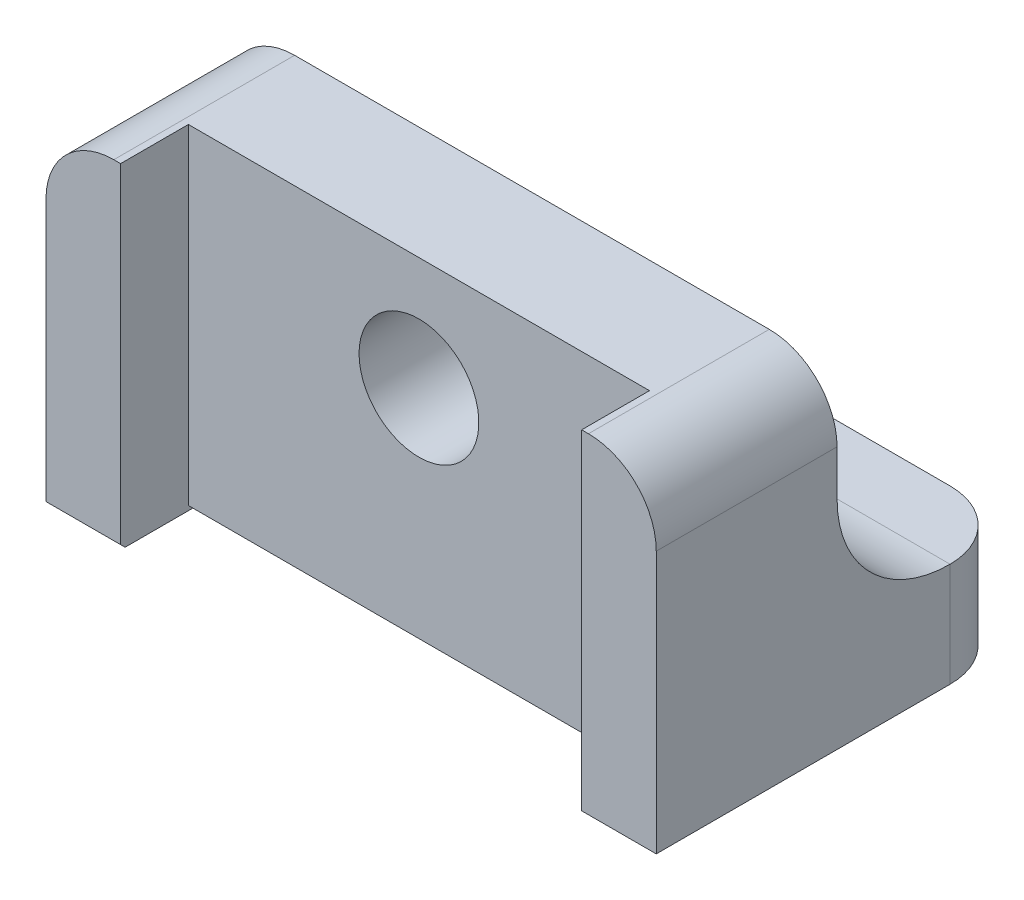
ISO-10303-21;
HEADER;
FILE_DESCRIPTION(('STEP AP214'),'2;1');
FILE_NAME('part.step','',(''),(''),'','','');
FILE_SCHEMA(('AUTOMOTIVE_DESIGN { 1 0 10303 214 1 1 1 1 }'));
ENDSEC;
DATA;
#1=APPLICATION_CONTEXT('core data for automotive mechanical design processes');
#2=APPLICATION_PROTOCOL_DEFINITION('international standard','automotive_design',2000,#1);
#3=PRODUCT_CONTEXT('',#1,'mechanical');
#4=PRODUCT('Part','Part','',(#3));
#5=PRODUCT_RELATED_PRODUCT_CATEGORY('part','',(#4));
#6=PRODUCT_DEFINITION_FORMATION('','',#4);
#7=PRODUCT_DEFINITION_CONTEXT('part definition',#1,'design');
#8=PRODUCT_DEFINITION('design','',#6,#7);
#9=PRODUCT_DEFINITION_SHAPE('','',#8);
#10=(LENGTH_UNIT() NAMED_UNIT(*) SI_UNIT(.MILLI.,.METRE.));
#11=(NAMED_UNIT(*) PLANE_ANGLE_UNIT() SI_UNIT($,.RADIAN.));
#12=(NAMED_UNIT(*) SI_UNIT($,.STERADIAN.) SOLID_ANGLE_UNIT());
#13=UNCERTAINTY_MEASURE_WITH_UNIT(LENGTH_MEASURE(1.E-05),#10,'distance_accuracy_value','');
#14=(GEOMETRIC_REPRESENTATION_CONTEXT(3) GLOBAL_UNCERTAINTY_ASSIGNED_CONTEXT((#13)) GLOBAL_UNIT_ASSIGNED_CONTEXT((#10,
#11,#12)) REPRESENTATION_CONTEXT('',''));
#15=CARTESIAN_POINT('',(0.,0.,0.));
#16=DIRECTION('',(0.,0.,1.));
#17=DIRECTION('',(1.,0.,0.));
#18=AXIS2_PLACEMENT_3D('',#15,#16,#17);
#19=CARTESIAN_POINT('',(-13.5,10.,-20.0000000000001));
#20=DIRECTION('',(0.999999999999999,0.,0.));
#21=DIRECTION('',(0.,0.,-1.));
#22=AXIS2_PLACEMENT_3D('',#19,#20,#21);
#23=CYLINDRICAL_SURFACE('',#22,5.);
#24=CARTESIAN_POINT('',(0.,10.,-20.0000000000001));
#25=DIRECTION('',(0.707106781186546,0.,0.707106781186547));
#26=DIRECTION('',(0.707106781186546,0.,-0.707106781186547));
#27=AXIS2_PLACEMENT_3D('',#24,#25,#26);
#28=ELLIPSE('',#27,7.07106781186548,5.);
#29=CARTESIAN_POINT('',(0.,5.,-20.));
#30=VERTEX_POINT('',#29);
#31=CARTESIAN_POINT('',(-5.,10.,-15.));
#32=VERTEX_POINT('',#31);
#33=EDGE_CURVE('E192',#30,#32,#28,.F.);
#34=ORIENTED_EDGE('',*,*,#33,.F.);
#35=DIRECTION('',(-0.999999999999999,0.,0.));
#36=VECTOR('',#35,1.);
#37=CARTESIAN_POINT('',(13.5,5.,-20.));
#38=LINE('',#37,#36);
#39=CARTESIAN_POINT('',(-13.5,5.,-20.0000000000001));
#40=VERTEX_POINT('',#39);
#41=EDGE_CURVE('E228',#40,#30,#38,.F.);
#42=ORIENTED_EDGE('',*,*,#41,.F.);
#43=CARTESIAN_POINT('',(-13.5,10.,-20.0000000000001));
#44=DIRECTION('',(0.999999999999999,0.,0.));
#45=DIRECTION('',(0.,0.,-1.));
#46=AXIS2_PLACEMENT_3D('',#43,#44,#45);
#47=CIRCLE('',#46,5.);
#48=CARTESIAN_POINT('',(-13.5,10.,-15.0000000000001));
#49=VERTEX_POINT('',#48);
#50=EDGE_CURVE('E218',#49,#40,#47,.T.);
#51=ORIENTED_EDGE('',*,*,#50,.F.);
#52=DIRECTION('',(-0.999999999999999,0.,0.));
#53=VECTOR('',#52,1.);
#54=CARTESIAN_POINT('',(-13.5,10.,-15.0000000000001));
#55=LINE('',#54,#53);
#56=EDGE_CURVE('E209',#32,#49,#55,.T.);
#57=ORIENTED_EDGE('',*,*,#56,.F.);
#58=EDGE_LOOP('',(#34,#42,#51,#57));
#59=FACE_BOUND('',#58,.T.);
#60=ADVANCED_FACE('F42',(#59),#23,.F.);
#61=CARTESIAN_POINT('',(0.,10.,-20.0000000000001));
#62=DIRECTION('',(0.707106781186546,0.,-0.707106781186547));
#63=DIRECTION('',(0.707106781186546,0.,0.707106781186547));
#64=AXIS2_PLACEMENT_3D('',#61,#62,#63);
#65=ELLIPSE('',#64,7.07106781186548,5.);
#66=CARTESIAN_POINT('',(5.,10.,-15.));
#67=VERTEX_POINT('',#66);
#68=EDGE_CURVE('E197',#67,#30,#65,.T.);
#69=ORIENTED_EDGE('',*,*,#68,.F.);
#70=CARTESIAN_POINT('',(13.5,10.,-15.));
#71=VERTEX_POINT('',#70);
#72=EDGE_CURVE('E212',#71,#67,#55,.T.);
#73=ORIENTED_EDGE('',*,*,#72,.F.);
#74=CARTESIAN_POINT('',(13.5,10.,-20.0000000000001));
#75=DIRECTION('',(-0.999999999999999,0.,0.));
#76=DIRECTION('',(0.,0.,1.));
#77=AXIS2_PLACEMENT_3D('',#74,#75,#76);
#78=CIRCLE('',#77,5.);
#79=CARTESIAN_POINT('',(13.5,5.,-20.));
#80=VERTEX_POINT('',#79);
#81=EDGE_CURVE('E232',#80,#71,#78,.T.);
#82=ORIENTED_EDGE('',*,*,#81,.F.);
#83=EDGE_CURVE('E221',#30,#80,#38,.F.);
#84=ORIENTED_EDGE('',*,*,#83,.F.);
#85=EDGE_LOOP('',(#69,#73,#82,#84));
#86=FACE_BOUND('',#85,.T.);
#87=ADVANCED_FACE('F469',(#86),#23,.F.);
#88=CARTESIAN_POINT('',(0.,5.,0.));
#89=DIRECTION('',(0.,-1.,0.));
#90=DIRECTION('',(0.,0.,-1.));
#91=AXIS2_PLACEMENT_3D('',#88,#89,#90);
#92=PLANE('',#91);
#93=ORIENTED_EDGE('',*,*,#41,.T.);
#94=ORIENTED_EDGE('',*,*,#83,.T.);
#95=CARTESIAN_POINT('',(10.5,5.,-20.));
#96=DIRECTION('',(0.,-1.,0.));
#97=DIRECTION('',(0.,0.,-1.));
#98=AXIS2_PLACEMENT_3D('',#95,#96,#97);
#99=CIRCLE('',#98,3.);
#100=CARTESIAN_POINT('',(10.5,5.,-23.));
#101=VERTEX_POINT('',#100);
#102=EDGE_CURVE('E264',#80,#101,#99,.F.);
#103=ORIENTED_EDGE('',*,*,#102,.T.);
#104=DIRECTION('',(-0.999999999999999,0.,0.));
#105=VECTOR('',#104,1.);
#106=CARTESIAN_POINT('',(-13.5,5.,-23.0000000000001));
#107=LINE('',#106,#105);
#108=CARTESIAN_POINT('',(-10.5,5.,-23.));
#109=VERTEX_POINT('',#108);
#110=EDGE_CURVE('E353',#101,#109,#107,.T.);
#111=ORIENTED_EDGE('',*,*,#110,.T.);
#112=CARTESIAN_POINT('',(-10.5,5.,-20.));
#113=DIRECTION('',(0.,-1.,0.));
#114=DIRECTION('',(0.,0.,-1.));
#115=AXIS2_PLACEMENT_3D('',#112,#113,#114);
#116=CIRCLE('',#115,3.);
#117=EDGE_CURVE('E266',#109,#40,#116,.F.);
#118=ORIENTED_EDGE('',*,*,#117,.T.);
#119=EDGE_LOOP('',(#93,#94,#103,#111,#118));
#120=FACE_BOUND('',#119,.T.);
#121=ADVANCED_FACE('F431',(#120),#92,.F.);
#122=CARTESIAN_POINT('',(10.2,5.,-7.00000000000003));
#123=DIRECTION('',(0.999999999999999,0.,0.));
#124=DIRECTION('',(0.,0.,-1.));
#125=AXIS2_PLACEMENT_3D('',#122,#123,#124);
#126=PLANE('',#125);
#127=DIRECTION('',(0.,-1.,0.));
#128=VECTOR('',#127,1.);
#129=CARTESIAN_POINT('',(10.2,5.,-10.));
#130=LINE('',#129,#128);
#131=CARTESIAN_POINT('',(10.2,15.,-10.0000000000001));
#132=VERTEX_POINT('',#131);
#133=CARTESIAN_POINT('',(10.2,0.400000000000011,-10.));
#134=VERTEX_POINT('',#133);
#135=EDGE_CURVE('E63',#132,#134,#130,.T.);
#136=ORIENTED_EDGE('',*,*,#135,.T.);
#137=DIRECTION('',(0.,0.707106781186552,0.707106781186544));
#138=VECTOR('',#137,1.);
#139=CARTESIAN_POINT('',(10.2,0.400000000000011,-10.));
#140=LINE('',#139,#138);
#141=CARTESIAN_POINT('',(10.2,0.199999999999978,-10.2));
#142=VERTEX_POINT('',#141);
#143=EDGE_CURVE('E50',#142,#134,#140,.T.);
#144=ORIENTED_EDGE('',*,*,#143,.F.);
#145=DIRECTION('',(0.,0.,1.));
#146=VECTOR('',#145,1.);
#147=CARTESIAN_POINT('',(10.2,0.199999999999978,-7.00000000000003));
#148=LINE('',#147,#146);
#149=CARTESIAN_POINT('',(10.2,0.199999999999978,-7.20000000000004));
#150=VERTEX_POINT('',#149);
#151=EDGE_CURVE('E57',#142,#150,#148,.T.);
#152=ORIENTED_EDGE('',*,*,#151,.T.);
#153=DIRECTION('',(0.,-0.707106781186552,-0.707106781186544));
#154=VECTOR('',#153,1.);
#155=CARTESIAN_POINT('',(10.2,2.70000000000004,-4.70000000000004));
#156=LINE('',#155,#154);
#157=CARTESIAN_POINT('',(10.2,0.400000000000011,-7.00000000000003));
#158=VERTEX_POINT('',#157);
#159=EDGE_CURVE('E12',#158,#150,#156,.T.);
#160=ORIENTED_EDGE('',*,*,#159,.F.);
#161=DIRECTION('',(0.,-1.,0.));
#162=VECTOR('',#161,1.);
#163=CARTESIAN_POINT('',(10.2,5.,-7.00000000000003));
#164=LINE('',#163,#162);
#165=CARTESIAN_POINT('',(10.2,15.,-7.00000000000007));
#166=VERTEX_POINT('',#165);
#167=EDGE_CURVE('E219',#166,#158,#164,.T.);
#168=ORIENTED_EDGE('',*,*,#167,.F.);
#169=DIRECTION('',(0.,0.,1.));
#170=VECTOR('',#169,1.);
#171=CARTESIAN_POINT('',(10.2,15.,-7.00000000000007));
#172=LINE('',#171,#170);
#173=EDGE_CURVE('E354',#132,#166,#172,.T.);
#174=ORIENTED_EDGE('',*,*,#173,.F.);
#175=EDGE_LOOP('',(#136,#144,#152,#160,#168,#174));
#176=FACE_BOUND('',#175,.T.);
#177=ADVANCED_FACE('F44',(#176),#126,.F.);
#178=CARTESIAN_POINT('',(13.5,5.,-7.00000000000003));
#179=DIRECTION('',(0.,0.,-1.));
#180=DIRECTION('',(-0.999999999999999,0.,0.));
#181=AXIS2_PLACEMENT_3D('',#178,#179,#180);
#182=PLANE('',#181);
#183=ORIENTED_EDGE('',*,*,#167,.T.);
#184=DIRECTION('',(0.999999999999999,0.,0.));
#185=VECTOR('',#184,1.);
#186=CARTESIAN_POINT('',(13.5,0.400000000000011,-7.00000000000003));
#187=LINE('',#186,#185);
#188=CARTESIAN_POINT('',(13.5,0.400000000000011,-7.00000000000003));
#189=VERTEX_POINT('',#188);
#190=EDGE_CURVE('E295',#158,#189,#187,.T.);
#191=ORIENTED_EDGE('',*,*,#190,.T.);
#192=DIRECTION('',(0.,-1.,0.));
#193=VECTOR('',#192,1.);
#194=CARTESIAN_POINT('',(13.5,5.,-7.00000000000003));
#195=LINE('',#194,#193);
#196=CARTESIAN_POINT('',(13.5,12.,-7.00000000000004));
#197=VERTEX_POINT('',#196);
#198=EDGE_CURVE('E223',#197,#189,#195,.T.);
#199=ORIENTED_EDGE('',*,*,#198,.F.);
#200=CARTESIAN_POINT('',(10.5,12.,-7.00000000000003));
#201=DIRECTION('',(0.,0.,-1.));
#202=DIRECTION('',(-0.999999999999999,0.,0.));
#203=AXIS2_PLACEMENT_3D('',#200,#201,#202);
#204=CIRCLE('',#203,3.);
#205=CARTESIAN_POINT('',(10.5,15.,-7.00000000000003));
#206=VERTEX_POINT('',#205);
#207=EDGE_CURVE('E257',#197,#206,#204,.F.);
#208=ORIENTED_EDGE('',*,*,#207,.T.);
#209=DIRECTION('',(0.999999999999999,0.,0.));
#210=VECTOR('',#209,1.);
#211=CARTESIAN_POINT('',(10.,15.,-7.00000000000004));
#212=LINE('',#211,#210);
#213=EDGE_CURVE('E356',#166,#206,#212,.T.);
#214=ORIENTED_EDGE('',*,*,#213,.F.);
#215=EDGE_LOOP('',(#183,#191,#199,#208,#214));
#216=FACE_BOUND('',#215,.T.);
#217=ADVANCED_FACE('F375',(#216),#182,.F.);
#218=CARTESIAN_POINT('',(13.5,5.,-23.));
#219=DIRECTION('',(-0.999999999999999,0.,0.));
#220=DIRECTION('',(0.,0.,1.));
#221=AXIS2_PLACEMENT_3D('',#218,#219,#220);
#222=PLANE('',#221);
#223=ORIENTED_EDGE('',*,*,#198,.T.);
#224=DIRECTION('',(0.,0.,-1.));
#225=VECTOR('',#224,1.);
#226=CARTESIAN_POINT('',(13.5,0.400000000000011,-20.));
#227=LINE('',#226,#225);
#228=CARTESIAN_POINT('',(13.5,0.400000000000011,-20.));
#229=VERTEX_POINT('',#228);
#230=EDGE_CURVE('E297',#189,#229,#227,.T.);
#231=ORIENTED_EDGE('',*,*,#230,.T.);
#232=DIRECTION('',(0.,-1.,0.));
#233=VECTOR('',#232,1.);
#234=CARTESIAN_POINT('',(13.5,5.,-20.));
#235=LINE('',#234,#233);
#236=EDGE_CURVE('E253',#229,#80,#235,.F.);
#237=ORIENTED_EDGE('',*,*,#236,.T.);
#238=ORIENTED_EDGE('',*,*,#81,.T.);
#239=DIRECTION('',(0.,-1.,0.));
#240=VECTOR('',#239,1.);
#241=CARTESIAN_POINT('',(13.5,15.,-15.0000000000001));
#242=LINE('',#241,#240);
#243=CARTESIAN_POINT('',(13.5,12.,-15.));
#244=VERTEX_POINT('',#243);
#245=EDGE_CURVE('E391',#244,#71,#242,.T.);
#246=ORIENTED_EDGE('',*,*,#245,.F.);
#247=DIRECTION('',(0.,0.,-1.));
#248=VECTOR('',#247,1.);
#249=CARTESIAN_POINT('',(13.5,12.,-7.00000000000004));
#250=LINE('',#249,#248);
#251=EDGE_CURVE('E255',#244,#197,#250,.F.);
#252=ORIENTED_EDGE('',*,*,#251,.T.);
#253=EDGE_LOOP('',(#223,#231,#237,#238,#246,#252));
#254=FACE_BOUND('',#253,.T.);
#255=ADVANCED_FACE('F404',(#254),#222,.F.);
#256=CARTESIAN_POINT('',(-13.5,5.,-23.0000000000001));
#257=DIRECTION('',(0.,0.,1.));
#258=DIRECTION('',(0.999999999999999,0.,0.));
#259=AXIS2_PLACEMENT_3D('',#256,#257,#258);
#260=PLANE('',#259);
#261=DIRECTION('',(0.,-1.,0.));
#262=VECTOR('',#261,1.);
#263=CARTESIAN_POINT('',(10.5,5.,-23.));
#264=LINE('',#263,#262);
#265=CARTESIAN_POINT('',(10.5,0.400000000000011,-23.));
#266=VERTEX_POINT('',#265);
#267=EDGE_CURVE('E259',#101,#266,#264,.T.);
#268=ORIENTED_EDGE('',*,*,#267,.T.);
#269=DIRECTION('',(-0.999999999999999,0.,0.));
#270=VECTOR('',#269,1.);
#271=CARTESIAN_POINT('',(-10.5,0.400000000000011,-23.));
#272=LINE('',#271,#270);
#273=CARTESIAN_POINT('',(-10.5,0.400000000000011,-23.));
#274=VERTEX_POINT('',#273);
#275=EDGE_CURVE('E301',#266,#274,#272,.T.);
#276=ORIENTED_EDGE('',*,*,#275,.T.);
#277=DIRECTION('',(0.,-1.,0.));
#278=VECTOR('',#277,1.);
#279=CARTESIAN_POINT('',(-10.5,5.,-23.));
#280=LINE('',#279,#278);
#281=EDGE_CURVE('E262',#274,#109,#280,.F.);
#282=ORIENTED_EDGE('',*,*,#281,.T.);
#283=ORIENTED_EDGE('',*,*,#110,.F.);
#284=EDGE_LOOP('',(#268,#276,#282,#283));
#285=FACE_BOUND('',#284,.T.);
#286=ADVANCED_FACE('F427',(#285),#260,.F.);
#287=CARTESIAN_POINT('',(-13.5,5.,-7.00000000000004));
#288=DIRECTION('',(0.999999999999999,0.,0.));
#289=DIRECTION('',(0.,0.,-1.));
#290=AXIS2_PLACEMENT_3D('',#287,#288,#289);
#291=PLANE('',#290);
#292=DIRECTION('',(0.,-1.,0.));
#293=VECTOR('',#292,1.);
#294=CARTESIAN_POINT('',(-13.5,5.,-20.0000000000001));
#295=LINE('',#294,#293);
#296=CARTESIAN_POINT('',(-13.5,0.400000000000011,-20.));
#297=VERTEX_POINT('',#296);
#298=EDGE_CURVE('E243',#40,#297,#295,.T.);
#299=ORIENTED_EDGE('',*,*,#298,.T.);
#300=DIRECTION('',(0.,0.,1.));
#301=VECTOR('',#300,1.);
#302=CARTESIAN_POINT('',(-13.5,0.400000000000011,-7.00000000000003));
#303=LINE('',#302,#301);
#304=CARTESIAN_POINT('',(-13.5,0.400000000000011,-7.00000000000003));
#305=VERTEX_POINT('',#304);
#306=EDGE_CURVE('E305',#297,#305,#303,.T.);
#307=ORIENTED_EDGE('',*,*,#306,.T.);
#308=DIRECTION('',(0.,-1.,0.));
#309=VECTOR('',#308,1.);
#310=CARTESIAN_POINT('',(-13.5,5.,-7.00000000000004));
#311=LINE('',#310,#309);
#312=CARTESIAN_POINT('',(-13.5,12.,-7.00000000000007));
#313=VERTEX_POINT('',#312);
#314=EDGE_CURVE('E337',#313,#305,#311,.T.);
#315=ORIENTED_EDGE('',*,*,#314,.F.);
#316=DIRECTION('',(0.,0.,1.));
#317=VECTOR('',#316,1.);
#318=CARTESIAN_POINT('',(-13.5,12.,-15.0000000000001));
#319=LINE('',#318,#317);
#320=CARTESIAN_POINT('',(-13.5,12.,-15.0000000000001));
#321=VERTEX_POINT('',#320);
#322=EDGE_CURVE('E246',#313,#321,#319,.F.);
#323=ORIENTED_EDGE('',*,*,#322,.T.);
#324=DIRECTION('',(0.,-1.,0.));
#325=VECTOR('',#324,1.);
#326=CARTESIAN_POINT('',(-13.5,15.,-15.0000000000001));
#327=LINE('',#326,#325);
#328=EDGE_CURVE('E389',#321,#49,#327,.T.);
#329=ORIENTED_EDGE('',*,*,#328,.T.);
#330=ORIENTED_EDGE('',*,*,#50,.T.);
#331=EDGE_LOOP('',(#299,#307,#315,#323,#329,#330));
#332=FACE_BOUND('',#331,.T.);
#333=ADVANCED_FACE('F440',(#332),#291,.F.);
#334=CARTESIAN_POINT('',(-10.,5.,-7.00000000000006));
#335=DIRECTION('',(0.,0.,-1.));
#336=DIRECTION('',(-0.999999999999999,0.,0.));
#337=AXIS2_PLACEMENT_3D('',#334,#335,#336);
#338=PLANE('',#337);
#339=ORIENTED_EDGE('',*,*,#314,.T.);
#340=DIRECTION('',(0.999999999999999,0.,0.));
#341=VECTOR('',#340,1.);
#342=CARTESIAN_POINT('',(-10.,0.400000000000011,-7.00000000000003));
#343=LINE('',#342,#341);
#344=CARTESIAN_POINT('',(-10.2,0.400000000000011,-7.00000000000003));
#345=VERTEX_POINT('',#344);
#346=EDGE_CURVE('E202',#305,#345,#343,.T.);
#347=ORIENTED_EDGE('',*,*,#346,.T.);
#348=DIRECTION('',(0.,-1.,0.));
#349=VECTOR('',#348,1.);
#350=CARTESIAN_POINT('',(-10.2,5.,-7.00000000000003));
#351=LINE('',#350,#349);
#352=CARTESIAN_POINT('',(-10.2,15.,-7.00000000000007));
#353=VERTEX_POINT('',#352);
#354=EDGE_CURVE('E334',#353,#345,#351,.T.);
#355=ORIENTED_EDGE('',*,*,#354,.F.);
#356=DIRECTION('',(0.999999999999999,0.,0.));
#357=VECTOR('',#356,1.);
#358=CARTESIAN_POINT('',(-13.5,15.,-7.00000000000007));
#359=LINE('',#358,#357);
#360=CARTESIAN_POINT('',(-10.5,15.,-7.00000000000003));
#361=VERTEX_POINT('',#360);
#362=EDGE_CURVE('E343',#361,#353,#359,.T.);
#363=ORIENTED_EDGE('',*,*,#362,.F.);
#364=CARTESIAN_POINT('',(-10.5,12.,-7.00000000000003));
#365=DIRECTION('',(0.,0.,-1.));
#366=DIRECTION('',(-0.999999999999999,0.,0.));
#367=AXIS2_PLACEMENT_3D('',#364,#365,#366);
#368=CIRCLE('',#367,3.);
#369=EDGE_CURVE('E241',#361,#313,#368,.F.);
#370=ORIENTED_EDGE('',*,*,#369,.T.);
#371=EDGE_LOOP('',(#339,#347,#355,#363,#370));
#372=FACE_BOUND('',#371,.T.);
#373=ADVANCED_FACE('F453',(#372),#338,.F.);
#374=CARTESIAN_POINT('',(-10.2,5.,-10.));
#375=DIRECTION('',(-0.999999999999999,0.,0.));
#376=DIRECTION('',(0.,0.,1.));
#377=AXIS2_PLACEMENT_3D('',#374,#375,#376);
#378=PLANE('',#377);
#379=ORIENTED_EDGE('',*,*,#354,.T.);
#380=DIRECTION('',(0.,-0.707106781186552,-0.707106781186544));
#381=VECTOR('',#380,1.);
#382=CARTESIAN_POINT('',(-10.2,0.400000000000011,-7.00000000000003));
#383=LINE('',#382,#381);
#384=CARTESIAN_POINT('',(-10.2,0.199999999999978,-7.20000000000004));
#385=VERTEX_POINT('',#384);
#386=EDGE_CURVE('E307',#345,#385,#383,.T.);
#387=ORIENTED_EDGE('',*,*,#386,.T.);
#388=DIRECTION('',(0.,0.,-1.));
#389=VECTOR('',#388,1.);
#390=CARTESIAN_POINT('',(-10.2,0.199999999999978,-10.));
#391=LINE('',#390,#389);
#392=CARTESIAN_POINT('',(-10.2,0.199999999999978,-10.2));
#393=VERTEX_POINT('',#392);
#394=EDGE_CURVE('E292',#385,#393,#391,.T.);
#395=ORIENTED_EDGE('',*,*,#394,.T.);
#396=DIRECTION('',(0.,-0.707106781186552,-0.707106781186544));
#397=VECTOR('',#396,1.);
#398=CARTESIAN_POINT('',(-10.2,0.400000000000011,-10.));
#399=LINE('',#398,#397);
#400=CARTESIAN_POINT('',(-10.2,0.400000000000011,-10.));
#401=VERTEX_POINT('',#400);
#402=EDGE_CURVE('E349',#401,#393,#399,.T.);
#403=ORIENTED_EDGE('',*,*,#402,.F.);
#404=DIRECTION('',(0.,-1.,0.));
#405=VECTOR('',#404,1.);
#406=CARTESIAN_POINT('',(-10.2,5.,-10.));
#407=LINE('',#406,#405);
#408=CARTESIAN_POINT('',(-10.2,15.,-10.0000000000001));
#409=VERTEX_POINT('',#408);
#410=EDGE_CURVE('E338',#409,#401,#407,.T.);
#411=ORIENTED_EDGE('',*,*,#410,.F.);
#412=DIRECTION('',(0.,0.,-1.));
#413=VECTOR('',#412,1.);
#414=CARTESIAN_POINT('',(-10.2,15.,-10.0000000000001));
#415=LINE('',#414,#413);
#416=EDGE_CURVE('E339',#353,#409,#415,.T.);
#417=ORIENTED_EDGE('',*,*,#416,.F.);
#418=EDGE_LOOP('',(#379,#387,#395,#403,#411,#417));
#419=FACE_BOUND('',#418,.T.);
#420=ADVANCED_FACE('F456',(#419),#378,.F.);
#421=CARTESIAN_POINT('',(-10.,5.,-10.0000000000001));
#422=DIRECTION('',(0.,0.,-1.));
#423=DIRECTION('',(-0.999999999999999,0.,0.));
#424=AXIS2_PLACEMENT_3D('',#421,#422,#423);
#425=PLANE('',#424);
#426=CARTESIAN_POINT('',(0.,10.,-10.0000000000001));
#427=DIRECTION('',(0.,0.,-1.));
#428=DIRECTION('',(-0.999999999999999,0.,0.));
#429=AXIS2_PLACEMENT_3D('',#426,#427,#428);
#430=CIRCLE('',#429,2.65);
#431=CARTESIAN_POINT('',(-2.65,10.,-10.0000000000001));
#432=VERTEX_POINT('',#431);
#433=EDGE_CURVE('E357',#432,#432,#430,.T.);
#434=ORIENTED_EDGE('',*,*,#433,.T.);
#435=EDGE_LOOP('',(#434));
#436=FACE_BOUND('',#435,.T.);
#437=ORIENTED_EDGE('',*,*,#410,.T.);
#438=DIRECTION('',(0.999999999999999,0.,0.));
#439=VECTOR('',#438,1.);
#440=CARTESIAN_POINT('',(10.,0.400000000000011,-10.));
#441=LINE('',#440,#439);
#442=EDGE_CURVE('E293',#401,#134,#441,.T.);
#443=ORIENTED_EDGE('',*,*,#442,.T.);
#444=ORIENTED_EDGE('',*,*,#135,.F.);
#445=DIRECTION('',(0.999999999999999,0.,0.));
#446=VECTOR('',#445,1.);
#447=CARTESIAN_POINT('',(-10.,15.,-10.0000000000001));
#448=LINE('',#447,#446);
#449=EDGE_CURVE('E342',#409,#132,#448,.T.);
#450=ORIENTED_EDGE('',*,*,#449,.F.);
#451=EDGE_LOOP('',(#437,#443,#444,#450));
#452=FACE_BOUND('',#451,.T.);
#453=ADVANCED_FACE('F457',(#436,#452),#425,.F.);
#454=CARTESIAN_POINT('',(0.,0.,0.));
#455=DIRECTION('',(0.,-1.,0.));
#456=DIRECTION('',(0.,0.,-1.));
#457=AXIS2_PLACEMENT_3D('',#454,#455,#456);
#458=PLANE('',#457);
#459=DIRECTION('',(0.,0.,1.));
#460=VECTOR('',#459,1.);
#461=CARTESIAN_POINT('',(-10.4,0.,-7.00000000000003));
#462=LINE('',#461,#460);
#463=CARTESIAN_POINT('',(-10.4,0.,-10.4));
#464=VERTEX_POINT('',#463);
#465=CARTESIAN_POINT('',(-10.4,0.,-7.40000000000002));
#466=VERTEX_POINT('',#465);
#467=EDGE_CURVE('E287',#464,#466,#462,.T.);
#468=ORIENTED_EDGE('',*,*,#467,.T.);
#469=DIRECTION('',(-0.999999999999999,0.,0.));
#470=VECTOR('',#469,1.);
#471=CARTESIAN_POINT('',(-13.5,0.,-7.40000000000003));
#472=LINE('',#471,#470);
#473=CARTESIAN_POINT('',(-13.1,0.,-7.40000000000003));
#474=VERTEX_POINT('',#473);
#475=EDGE_CURVE('E289',#466,#474,#472,.T.);
#476=ORIENTED_EDGE('',*,*,#475,.T.);
#477=DIRECTION('',(0.,0.,-1.));
#478=VECTOR('',#477,1.);
#479=CARTESIAN_POINT('',(-13.1,0.,-20.));
#480=LINE('',#479,#478);
#481=CARTESIAN_POINT('',(-13.1,0.,-20.));
#482=VERTEX_POINT('',#481);
#483=EDGE_CURVE('E271',#474,#482,#480,.T.);
#484=ORIENTED_EDGE('',*,*,#483,.T.);
#485=CARTESIAN_POINT('',(-10.5,0.,-20.));
#486=DIRECTION('',(0.,-1.,0.));
#487=DIRECTION('',(0.,0.,-1.));
#488=AXIS2_PLACEMENT_3D('',#485,#486,#487);
#489=CIRCLE('',#488,2.6);
#490=CARTESIAN_POINT('',(-10.5,0.,-22.6));
#491=VERTEX_POINT('',#490);
#492=EDGE_CURVE('E273',#482,#491,#489,.T.);
#493=ORIENTED_EDGE('',*,*,#492,.T.);
#494=DIRECTION('',(0.999999999999999,0.,0.));
#495=VECTOR('',#494,1.);
#496=CARTESIAN_POINT('',(10.5,0.,-22.6));
#497=LINE('',#496,#495);
#498=CARTESIAN_POINT('',(10.5,0.,-22.6));
#499=VERTEX_POINT('',#498);
#500=EDGE_CURVE('E275',#491,#499,#497,.T.);
#501=ORIENTED_EDGE('',*,*,#500,.T.);
#502=CARTESIAN_POINT('',(10.5,0.,-20.));
#503=DIRECTION('',(0.,-1.,0.));
#504=DIRECTION('',(0.,0.,-1.));
#505=AXIS2_PLACEMENT_3D('',#502,#503,#504);
#506=CIRCLE('',#505,2.6);
#507=CARTESIAN_POINT('',(13.1,0.,-20.0000000000001));
#508=VERTEX_POINT('',#507);
#509=EDGE_CURVE('E277',#499,#508,#506,.T.);
#510=ORIENTED_EDGE('',*,*,#509,.T.);
#511=DIRECTION('',(0.,0.,1.));
#512=VECTOR('',#511,1.);
#513=CARTESIAN_POINT('',(13.1,0.,-7.00000000000003));
#514=LINE('',#513,#512);
#515=CARTESIAN_POINT('',(13.1,0.,-7.40000000000003));
#516=VERTEX_POINT('',#515);
#517=EDGE_CURVE('E279',#508,#516,#514,.T.);
#518=ORIENTED_EDGE('',*,*,#517,.T.);
#519=DIRECTION('',(-0.999999999999999,0.,0.));
#520=VECTOR('',#519,1.);
#521=CARTESIAN_POINT('',(9.99999999999995,0.,-7.40000000000003));
#522=LINE('',#521,#520);
#523=CARTESIAN_POINT('',(10.4,0.,-7.40000000000003));
#524=VERTEX_POINT('',#523);
#525=EDGE_CURVE('E281',#516,#524,#522,.T.);
#526=ORIENTED_EDGE('',*,*,#525,.T.);
#527=DIRECTION('',(0.,0.,-1.));
#528=VECTOR('',#527,1.);
#529=CARTESIAN_POINT('',(10.4,0.,-10.));
#530=LINE('',#529,#528);
#531=CARTESIAN_POINT('',(10.4,0.,-10.4));
#532=VERTEX_POINT('',#531);
#533=EDGE_CURVE('E283',#524,#532,#530,.T.);
#534=ORIENTED_EDGE('',*,*,#533,.T.);
#535=DIRECTION('',(-0.999999999999999,0.,0.));
#536=VECTOR('',#535,1.);
#537=CARTESIAN_POINT('',(-10.,0.,-10.4));
#538=LINE('',#537,#536);
#539=EDGE_CURVE('E285',#532,#464,#538,.T.);
#540=ORIENTED_EDGE('',*,*,#539,.T.);
#541=EDGE_LOOP('',(#468,#476,#484,#493,#501,#510,#518,#526,#534,#540));
#542=FACE_BOUND('',#541,.T.);
#543=ADVANCED_FACE('F415',(#542),#458,.T.);
#544=CARTESIAN_POINT('',(-13.5,15.,-15.0000000000001));
#545=DIRECTION('',(0.,0.,1.));
#546=DIRECTION('',(0.999999999999999,0.,0.));
#547=AXIS2_PLACEMENT_3D('',#544,#545,#546);
#548=PLANE('',#547);
#549=ORIENTED_EDGE('',*,*,#72,.T.);
#550=CARTESIAN_POINT('',(0.,10.,-15.0000000000001));
#551=DIRECTION('',(0.,0.,-1.));
#552=DIRECTION('',(-0.999999999999999,0.,0.));
#553=AXIS2_PLACEMENT_3D('',#550,#551,#552);
#554=CIRCLE('',#553,5.);
#555=EDGE_CURVE('E195',#67,#32,#554,.T.);
#556=ORIENTED_EDGE('',*,*,#555,.T.);
#557=ORIENTED_EDGE('',*,*,#56,.T.);
#558=ORIENTED_EDGE('',*,*,#328,.F.);
#559=CARTESIAN_POINT('',(-10.5,12.,-15.));
#560=DIRECTION('',(0.,0.,1.));
#561=DIRECTION('',(0.999999999999999,0.,0.));
#562=AXIS2_PLACEMENT_3D('',#559,#560,#561);
#563=CIRCLE('',#562,3.);
#564=CARTESIAN_POINT('',(-10.5,15.,-15.));
#565=VERTEX_POINT('',#564);
#566=EDGE_CURVE('E250',#321,#565,#563,.F.);
#567=ORIENTED_EDGE('',*,*,#566,.T.);
#568=DIRECTION('',(-0.999999999999999,0.,0.));
#569=VECTOR('',#568,1.);
#570=CARTESIAN_POINT('',(-13.5,15.,-15.0000000000001));
#571=LINE('',#570,#569);
#572=CARTESIAN_POINT('',(10.5,15.,-15.));
#573=VERTEX_POINT('',#572);
#574=EDGE_CURVE('E382',#573,#565,#571,.T.);
#575=ORIENTED_EDGE('',*,*,#574,.F.);
#576=CARTESIAN_POINT('',(10.5,12.,-15.));
#577=DIRECTION('',(0.,0.,1.));
#578=DIRECTION('',(0.999999999999999,0.,0.));
#579=AXIS2_PLACEMENT_3D('',#576,#577,#578);
#580=CIRCLE('',#579,3.);
#581=EDGE_CURVE('E248',#573,#244,#580,.F.);
#582=ORIENTED_EDGE('',*,*,#581,.T.);
#583=ORIENTED_EDGE('',*,*,#245,.T.);
#584=EDGE_LOOP('',(#549,#556,#557,#558,#567,#575,#582,#583));
#585=FACE_BOUND('',#584,.T.);
#586=CARTESIAN_POINT('',(0.,10.,-15.0000000000001));
#587=DIRECTION('',(0.,0.,-1.));
#588=DIRECTION('',(-0.999999999999999,0.,0.));
#589=AXIS2_PLACEMENT_3D('',#586,#587,#588);
#590=CIRCLE('',#589,2.65);
#591=CARTESIAN_POINT('',(-2.65,10.,-15.0000000000001));
#592=VERTEX_POINT('',#591);
#593=EDGE_CURVE('E213',#592,#592,#590,.T.);
#594=ORIENTED_EDGE('',*,*,#593,.F.);
#595=EDGE_LOOP('',(#594));
#596=FACE_BOUND('',#595,.T.);
#597=ADVANCED_FACE('F206',(#585,#596),#548,.F.);
#598=CARTESIAN_POINT('',(0.,15.,0.));
#599=DIRECTION('',(0.,1.,0.));
#600=DIRECTION('',(0.,0.,1.));
#601=AXIS2_PLACEMENT_3D('',#598,#599,#600);
#602=PLANE('',#601);
#603=ORIENTED_EDGE('',*,*,#574,.T.);
#604=DIRECTION('',(0.,0.,1.));
#605=VECTOR('',#604,1.);
#606=CARTESIAN_POINT('',(-10.5,15.,-7.00000000000003));
#607=LINE('',#606,#605);
#608=EDGE_CURVE('E238',#565,#361,#607,.T.);
#609=ORIENTED_EDGE('',*,*,#608,.T.);
#610=ORIENTED_EDGE('',*,*,#362,.T.);
#611=ORIENTED_EDGE('',*,*,#416,.T.);
#612=ORIENTED_EDGE('',*,*,#449,.T.);
#613=ORIENTED_EDGE('',*,*,#173,.T.);
#614=ORIENTED_EDGE('',*,*,#213,.T.);
#615=DIRECTION('',(0.,0.,-1.));
#616=VECTOR('',#615,1.);
#617=CARTESIAN_POINT('',(10.5,15.,-15.));
#618=LINE('',#617,#616);
#619=EDGE_CURVE('E235',#206,#573,#618,.T.);
#620=ORIENTED_EDGE('',*,*,#619,.T.);
#621=EDGE_LOOP('',(#603,#609,#610,#611,#612,#613,#614,#620));
#622=FACE_BOUND('',#621,.T.);
#623=ADVANCED_FACE('F385',(#622),#602,.T.);
#624=CARTESIAN_POINT('',(-10.5,12.,0.));
#625=DIRECTION('',(0.,0.,-1.));
#626=DIRECTION('',(-0.999999999999999,0.,0.));
#627=AXIS2_PLACEMENT_3D('',#624,#625,#626);
#628=CYLINDRICAL_SURFACE('',#627,3.);
#629=ORIENTED_EDGE('',*,*,#566,.F.);
#630=ORIENTED_EDGE('',*,*,#322,.F.);
#631=ORIENTED_EDGE('',*,*,#369,.F.);
#632=ORIENTED_EDGE('',*,*,#608,.F.);
#633=EDGE_LOOP('',(#629,#630,#631,#632));
#634=FACE_BOUND('',#633,.T.);
#635=ADVANCED_FACE('F478',(#634),#628,.T.);
#636=CARTESIAN_POINT('',(10.5,12.,0.));
#637=DIRECTION('',(0.,0.,1.));
#638=DIRECTION('',(0.999999999999999,0.,0.));
#639=AXIS2_PLACEMENT_3D('',#636,#637,#638);
#640=CYLINDRICAL_SURFACE('',#639,3.);
#641=ORIENTED_EDGE('',*,*,#207,.F.);
#642=ORIENTED_EDGE('',*,*,#251,.F.);
#643=ORIENTED_EDGE('',*,*,#581,.F.);
#644=ORIENTED_EDGE('',*,*,#619,.F.);
#645=EDGE_LOOP('',(#641,#642,#643,#644));
#646=FACE_BOUND('',#645,.T.);
#647=ADVANCED_FACE('F481',(#646),#640,.T.);
#648=CARTESIAN_POINT('',(-10.5,5.,-20.));
#649=DIRECTION('',(0.,-1.,0.));
#650=DIRECTION('',(0.,0.,-1.));
#651=AXIS2_PLACEMENT_3D('',#648,#649,#650);
#652=CYLINDRICAL_SURFACE('',#651,3.);
#653=ORIENTED_EDGE('',*,*,#281,.F.);
#654=CARTESIAN_POINT('',(-10.5,0.400000000000011,-20.));
#655=DIRECTION('',(0.,-1.,0.));
#656=DIRECTION('',(0.,0.,-1.));
#657=AXIS2_PLACEMENT_3D('',#654,#655,#656);
#658=CIRCLE('',#657,3.);
#659=EDGE_CURVE('E303',#274,#297,#658,.F.);
#660=ORIENTED_EDGE('',*,*,#659,.T.);
#661=ORIENTED_EDGE('',*,*,#298,.F.);
#662=ORIENTED_EDGE('',*,*,#117,.F.);
#663=EDGE_LOOP('',(#653,#660,#661,#662));
#664=FACE_BOUND('',#663,.T.);
#665=ADVANCED_FACE('F435',(#664),#652,.T.);
#666=CARTESIAN_POINT('',(10.5,5.,-20.));
#667=DIRECTION('',(0.,-1.,0.));
#668=DIRECTION('',(0.,0.,-1.));
#669=AXIS2_PLACEMENT_3D('',#666,#667,#668);
#670=CYLINDRICAL_SURFACE('',#669,3.);
#671=ORIENTED_EDGE('',*,*,#236,.F.);
#672=CARTESIAN_POINT('',(10.5,0.400000000000011,-20.));
#673=DIRECTION('',(0.,-1.,0.));
#674=DIRECTION('',(0.,0.,-1.));
#675=AXIS2_PLACEMENT_3D('',#672,#673,#674);
#676=CIRCLE('',#675,3.);
#677=EDGE_CURVE('E299',#229,#266,#676,.F.);
#678=ORIENTED_EDGE('',*,*,#677,.T.);
#679=ORIENTED_EDGE('',*,*,#267,.F.);
#680=ORIENTED_EDGE('',*,*,#102,.F.);
#681=EDGE_LOOP('',(#671,#678,#679,#680));
#682=FACE_BOUND('',#681,.T.);
#683=ADVANCED_FACE('F423',(#682),#670,.T.);
#684=CARTESIAN_POINT('',(0.,10.,-7.00000000000004));
#685=DIRECTION('',(0.,0.,-1.));
#686=DIRECTION('',(-0.999999999999999,0.,0.));
#687=AXIS2_PLACEMENT_3D('',#684,#685,#686);
#688=CYLINDRICAL_SURFACE('',#687,2.65);
#689=ORIENTED_EDGE('',*,*,#593,.T.);
#690=EDGE_LOOP('',(#689));
#691=FACE_BOUND('',#690,.T.);
#692=ORIENTED_EDGE('',*,*,#433,.F.);
#693=EDGE_LOOP('',(#692));
#694=FACE_BOUND('',#693,.T.);
#695=ADVANCED_FACE('F490',(#691,#694),#688,.F.);
#696=CARTESIAN_POINT('',(0.,10.,-23.0000000000001));
#697=DIRECTION('',(0.,0.,1.));
#698=DIRECTION('',(0.999999999999999,0.,0.));
#699=AXIS2_PLACEMENT_3D('',#696,#697,#698);
#700=CYLINDRICAL_SURFACE('',#699,5.);
#701=ORIENTED_EDGE('',*,*,#33,.T.);
#702=ORIENTED_EDGE('',*,*,#555,.F.);
#703=ORIENTED_EDGE('',*,*,#68,.T.);
#704=EDGE_LOOP('',(#701,#702,#703));
#705=FACE_BOUND('',#704,.T.);
#706=ADVANCED_FACE('F194',(#705),#700,.F.);
#707=CARTESIAN_POINT('',(13.5,0.400000000000011,-23.));
#708=DIRECTION('',(0.707106781186549,-0.707106781186546,0.));
#709=DIRECTION('',(0.,0.,1.));
#710=AXIS2_PLACEMENT_3D('',#707,#708,#709);
#711=PLANE('',#710);
#712=DIRECTION('',(-0.577350269189623,-0.577350269189631,-0.577350269189624));
#713=VECTOR('',#712,1.);
#714=CARTESIAN_POINT('',(8.16666666666666,-4.93333333333335,-12.3333333333334));
#715=LINE('',#714,#713);
#716=EDGE_CURVE('E329',#516,#189,#715,.F.);
#717=ORIENTED_EDGE('',*,*,#716,.F.);
#718=ORIENTED_EDGE('',*,*,#517,.F.);
#719=DIRECTION('',(-0.707106781186543,-0.707106781186552,0.));
#720=VECTOR('',#719,1.);
#721=CARTESIAN_POINT('',(13.5,0.400000000000011,-20.));
#722=LINE('',#721,#720);
#723=EDGE_CURVE('E214',#229,#508,#722,.T.);
#724=ORIENTED_EDGE('',*,*,#723,.F.);
#725=ORIENTED_EDGE('',*,*,#230,.F.);
#726=EDGE_LOOP('',(#717,#718,#724,#725));
#727=FACE_BOUND('',#726,.T.);
#728=ADVANCED_FACE('F411',(#727),#711,.T.);
#729=CARTESIAN_POINT('',(10.5,0.,-20.));
#730=DIRECTION('',(0.,1.,0.));
#731=DIRECTION('',(0.,0.,1.));
#732=AXIS2_PLACEMENT_3D('',#729,#730,#731);
#733=CONICAL_SURFACE('',#732,2.6,0.785398163397445);
#734=ORIENTED_EDGE('',*,*,#723,.T.);
#735=ORIENTED_EDGE('',*,*,#509,.F.);
#736=DIRECTION('',(0.,-0.707106781186552,0.707106781186544));
#737=VECTOR('',#736,1.);
#738=CARTESIAN_POINT('',(10.5,0.400000000000011,-23.));
#739=LINE('',#738,#737);
#740=EDGE_CURVE('E326',#266,#499,#739,.T.);
#741=ORIENTED_EDGE('',*,*,#740,.F.);
#742=ORIENTED_EDGE('',*,*,#677,.F.);
#743=EDGE_LOOP('',(#734,#735,#741,#742));
#744=FACE_BOUND('',#743,.T.);
#745=ADVANCED_FACE('F418',(#744),#733,.T.);
#746=CARTESIAN_POINT('',(13.5,0.400000000000011,-7.00000000000003));
#747=DIRECTION('',(0.,-0.707106781186546,0.707106781186551));
#748=DIRECTION('',(-0.999999999999999,0.,0.));
#749=AXIS2_PLACEMENT_3D('',#746,#747,#748);
#750=PLANE('',#749);
#751=ORIENTED_EDGE('',*,*,#716,.T.);
#752=ORIENTED_EDGE('',*,*,#190,.F.);
#753=ORIENTED_EDGE('',*,*,#159,.T.);
#754=DIRECTION('',(0.577350269189623,-0.577350269189631,-0.577350269189625));
#755=VECTOR('',#754,1.);
#756=CARTESIAN_POINT('',(11.1666666666664,-0.766666666666693,-8.16666666666667));
#757=LINE('',#756,#755);
#758=EDGE_CURVE('E324',#524,#150,#757,.F.);
#759=ORIENTED_EDGE('',*,*,#758,.F.);
#760=ORIENTED_EDGE('',*,*,#525,.F.);
#761=EDGE_LOOP('',(#751,#752,#753,#759,#760));
#762=FACE_BOUND('',#761,.T.);
#763=ADVANCED_FACE('F372',(#762),#750,.T.);
#764=CARTESIAN_POINT('',(-13.5,0.400000000000011,-23.));
#765=DIRECTION('',(0.,-0.707106781186546,-0.707106781186551));
#766=DIRECTION('',(0.999999999999999,0.,0.));
#767=AXIS2_PLACEMENT_3D('',#764,#765,#766);
#768=PLANE('',#767);
#769=ORIENTED_EDGE('',*,*,#740,.T.);
#770=ORIENTED_EDGE('',*,*,#500,.F.);
#771=DIRECTION('',(0.,-0.707106781186552,0.707106781186544));
#772=VECTOR('',#771,1.);
#773=CARTESIAN_POINT('',(-10.5,0.400000000000011,-23.));
#774=LINE('',#773,#772);
#775=EDGE_CURVE('E321',#274,#491,#774,.T.);
#776=ORIENTED_EDGE('',*,*,#775,.F.);
#777=ORIENTED_EDGE('',*,*,#275,.F.);
#778=EDGE_LOOP('',(#769,#770,#776,#777));
#779=FACE_BOUND('',#778,.T.);
#780=ADVANCED_FACE('F505',(#779),#768,.T.);
#781=CARTESIAN_POINT('',(10.,0.400000000000011,-7.00000000000003));
#782=DIRECTION('',(-0.707106781186549,-0.707106781186546,0.));
#783=DIRECTION('',(0.,0.,-1.));
#784=AXIS2_PLACEMENT_3D('',#781,#782,#783);
#785=PLANE('',#784);
#786=ORIENTED_EDGE('',*,*,#758,.T.);
#787=ORIENTED_EDGE('',*,*,#151,.F.);
#788=DIRECTION('',(0.577350269189623,-0.577350269189631,-0.577350269189625));
#789=VECTOR('',#788,1.);
#790=CARTESIAN_POINT('',(3.33333333333341,7.06666666666667,-3.33333333333341));
#791=LINE('',#790,#789);
#792=EDGE_CURVE('E318',#532,#142,#791,.F.);
#793=ORIENTED_EDGE('',*,*,#792,.F.);
#794=ORIENTED_EDGE('',*,*,#533,.F.);
#795=EDGE_LOOP('',(#786,#787,#793,#794));
#796=FACE_BOUND('',#795,.T.);
#797=ADVANCED_FACE('F366',(#796),#785,.T.);
#798=CARTESIAN_POINT('',(-10.5,0.,-20.));
#799=DIRECTION('',(0.,1.,0.));
#800=DIRECTION('',(0.,0.,1.));
#801=AXIS2_PLACEMENT_3D('',#798,#799,#800);
#802=CONICAL_SURFACE('',#801,2.6,0.785398163397445);
#803=ORIENTED_EDGE('',*,*,#775,.T.);
#804=ORIENTED_EDGE('',*,*,#492,.F.);
#805=DIRECTION('',(0.707106781186543,-0.707106781186552,0.));
#806=VECTOR('',#805,1.);
#807=CARTESIAN_POINT('',(-13.5,0.400000000000011,-20.));
#808=LINE('',#807,#806);
#809=EDGE_CURVE('E315',#297,#482,#808,.T.);
#810=ORIENTED_EDGE('',*,*,#809,.F.);
#811=ORIENTED_EDGE('',*,*,#659,.F.);
#812=EDGE_LOOP('',(#803,#804,#810,#811));
#813=FACE_BOUND('',#812,.T.);
#814=ADVANCED_FACE('F444',(#813),#802,.T.);
#815=CARTESIAN_POINT('',(-10.,0.400000000000011,-10.));
#816=DIRECTION('',(0.,-0.707106781186546,0.707106781186551));
#817=DIRECTION('',(-0.999999999999999,0.,0.));
#818=AXIS2_PLACEMENT_3D('',#815,#816,#817);
#819=PLANE('',#818);
#820=ORIENTED_EDGE('',*,*,#792,.T.);
#821=ORIENTED_EDGE('',*,*,#143,.T.);
#822=ORIENTED_EDGE('',*,*,#442,.F.);
#823=ORIENTED_EDGE('',*,*,#402,.T.);
#824=DIRECTION('',(-0.577350269189623,-0.577350269189631,-0.577350269189624));
#825=VECTOR('',#824,1.);
#826=CARTESIAN_POINT('',(-10.,0.400000000000011,-10.));
#827=LINE('',#826,#825);
#828=EDGE_CURVE('E312',#464,#393,#827,.F.);
#829=ORIENTED_EDGE('',*,*,#828,.F.);
#830=ORIENTED_EDGE('',*,*,#539,.F.);
#831=EDGE_LOOP('',(#820,#821,#822,#823,#829,#830));
#832=FACE_BOUND('',#831,.T.);
#833=ADVANCED_FACE('F362',(#832),#819,.T.);
#834=CARTESIAN_POINT('',(-13.5,0.400000000000011,-7.00000000000003));
#835=DIRECTION('',(-0.707106781186549,-0.707106781186546,0.));
#836=DIRECTION('',(0.,0.,-1.));
#837=AXIS2_PLACEMENT_3D('',#834,#835,#836);
#838=PLANE('',#837);
#839=ORIENTED_EDGE('',*,*,#809,.T.);
#840=ORIENTED_EDGE('',*,*,#483,.F.);
#841=DIRECTION('',(-0.577350269189623,0.577350269189631,0.577350269189625));
#842=VECTOR('',#841,1.);
#843=CARTESIAN_POINT('',(-13.5,0.400000000000011,-7.00000000000003));
#844=LINE('',#843,#842);
#845=EDGE_CURVE('E310',#305,#474,#844,.F.);
#846=ORIENTED_EDGE('',*,*,#845,.F.);
#847=ORIENTED_EDGE('',*,*,#306,.F.);
#848=EDGE_LOOP('',(#839,#840,#846,#847));
#849=FACE_BOUND('',#848,.T.);
#850=ADVANCED_FACE('F447',(#849),#838,.T.);
#851=CARTESIAN_POINT('',(-10.,0.400000000000011,-10.));
#852=DIRECTION('',(0.707106781186549,-0.707106781186546,0.));
#853=DIRECTION('',(0.,0.,1.));
#854=AXIS2_PLACEMENT_3D('',#851,#852,#853);
#855=PLANE('',#854);
#856=ORIENTED_EDGE('',*,*,#828,.T.);
#857=ORIENTED_EDGE('',*,*,#394,.F.);
#858=DIRECTION('',(-0.577350269189623,-0.577350269189631,-0.577350269189624));
#859=VECTOR('',#858,1.);
#860=CARTESIAN_POINT('',(-11.,-0.599999999999989,-8.00000000000003));
#861=LINE('',#860,#859);
#862=EDGE_CURVE('E308',#466,#385,#861,.F.);
#863=ORIENTED_EDGE('',*,*,#862,.F.);
#864=ORIENTED_EDGE('',*,*,#467,.F.);
#865=EDGE_LOOP('',(#856,#857,#863,#864));
#866=FACE_BOUND('',#865,.T.);
#867=ADVANCED_FACE('F493',(#866),#855,.T.);
#868=CARTESIAN_POINT('',(-10.,0.400000000000011,-7.00000000000003));
#869=DIRECTION('',(0.,-0.707106781186546,0.707106781186551));
#870=DIRECTION('',(-0.999999999999999,0.,0.));
#871=AXIS2_PLACEMENT_3D('',#868,#869,#870);
#872=PLANE('',#871);
#873=ORIENTED_EDGE('',*,*,#845,.T.);
#874=ORIENTED_EDGE('',*,*,#475,.F.);
#875=ORIENTED_EDGE('',*,*,#862,.T.);
#876=ORIENTED_EDGE('',*,*,#386,.F.);
#877=ORIENTED_EDGE('',*,*,#346,.F.);
#878=EDGE_LOOP('',(#873,#874,#875,#876,#877));
#879=FACE_BOUND('',#878,.T.);
#880=ADVANCED_FACE('F451',(#879),#872,.T.);
#881=CLOSED_SHELL('',(#60,#87,#121,#177,#217,#255,#286,#333,#373,#420,#453,#543,#597,#623,#635,
#647,#665,#683,#695,#706,#728,#745,#763,#780,#797,#814,#833,#850,#867,#880));
#882=MANIFOLD_SOLID_BREP('B2',#881);
#883=ADVANCED_BREP_SHAPE_REPRESENTATION('',(#18,#882),#14);
#884=SHAPE_DEFINITION_REPRESENTATION(#9,#883);
ENDSEC;
END-ISO-10303-21;
